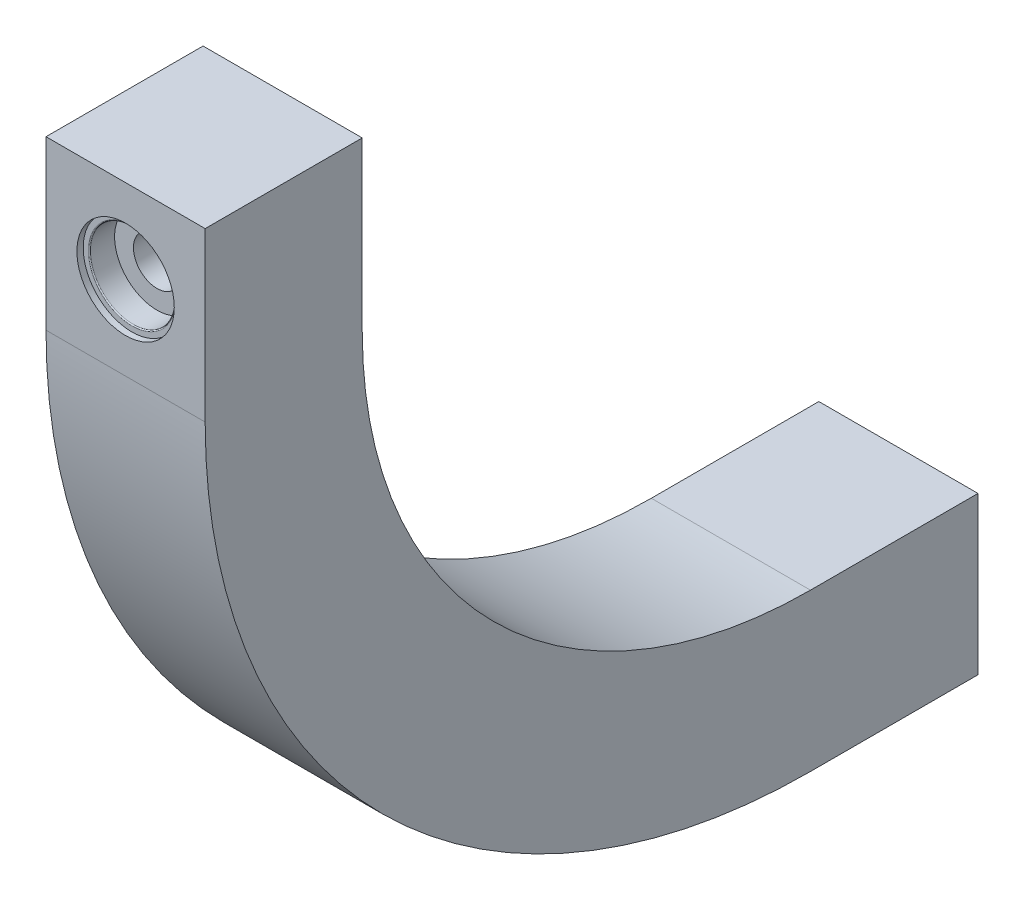
ISO-10303-21;
HEADER;
FILE_DESCRIPTION(('STEP AP214'),'2;1');
FILE_NAME('part.step','',(''),(''),'','','');
FILE_SCHEMA(('AUTOMOTIVE_DESIGN { 1 0 10303 214 1 1 1 1 }'));
ENDSEC;
DATA;
#1=APPLICATION_CONTEXT('core data for automotive mechanical design processes');
#2=APPLICATION_PROTOCOL_DEFINITION('international standard','automotive_design',2000,#1);
#3=PRODUCT_CONTEXT('',#1,'mechanical');
#4=PRODUCT('Part','Part','',(#3));
#5=PRODUCT_RELATED_PRODUCT_CATEGORY('part','',(#4));
#6=PRODUCT_DEFINITION_FORMATION('','',#4);
#7=PRODUCT_DEFINITION_CONTEXT('part definition',#1,'design');
#8=PRODUCT_DEFINITION('design','',#6,#7);
#9=PRODUCT_DEFINITION_SHAPE('','',#8);
#10=(LENGTH_UNIT() NAMED_UNIT(*) SI_UNIT(.MILLI.,.METRE.));
#11=(NAMED_UNIT(*) PLANE_ANGLE_UNIT() SI_UNIT($,.RADIAN.));
#12=(NAMED_UNIT(*) SI_UNIT($,.STERADIAN.) SOLID_ANGLE_UNIT());
#13=UNCERTAINTY_MEASURE_WITH_UNIT(LENGTH_MEASURE(1.E-05),#10,'distance_accuracy_value','');
#14=(GEOMETRIC_REPRESENTATION_CONTEXT(3) GLOBAL_UNCERTAINTY_ASSIGNED_CONTEXT((#13)) GLOBAL_UNIT_ASSIGNED_CONTEXT((#10,
#11,#12)) REPRESENTATION_CONTEXT('',''));
#15=CARTESIAN_POINT('',(0.,0.,0.));
#16=DIRECTION('',(0.,0.,1.));
#17=DIRECTION('',(1.,0.,0.));
#18=AXIS2_PLACEMENT_3D('',#15,#16,#17);
#19=CARTESIAN_POINT('',(-7.6,-7.99999999999999,8.00000000000008));
#20=DIRECTION('',(1.,0.,0.));
#21=DIRECTION('',(0.,0.,-1.));
#22=AXIS2_PLACEMENT_3D('',#19,#20,#21);
#23=CYLINDRICAL_SURFACE('',#22,57.8045814599999);
#24=DIRECTION('',(1.,0.,0.));
#25=VECTOR('',#24,1.);
#26=CARTESIAN_POINT('',(-7.6,-65.8045814599999,8.00000000000068));
#27=LINE('',#26,#25);
#28=CARTESIAN_POINT('',(-7.6,-65.8045814599999,8.00000000000068));
#29=VERTEX_POINT('',#28);
#30=CARTESIAN_POINT('',(7.6,-65.8045814599999,8.00000000000068));
#31=VERTEX_POINT('',#30);
#32=EDGE_CURVE('E100',#29,#31,#27,.T.);
#33=ORIENTED_EDGE('',*,*,#32,.T.);
#34=CARTESIAN_POINT('',(7.6,-7.99999999999999,8.00000000000008));
#35=DIRECTION('',(1.,0.,0.));
#36=DIRECTION('',(0.,0.,-1.));
#37=AXIS2_PLACEMENT_3D('',#34,#35,#36);
#38=CIRCLE('',#37,57.8045814599999);
#39=CARTESIAN_POINT('',(7.6,-7.99999999999999,65.80458146));
#40=VERTEX_POINT('',#39);
#41=EDGE_CURVE('E103',#40,#31,#38,.T.);
#42=ORIENTED_EDGE('',*,*,#41,.F.);
#43=DIRECTION('',(1.,0.,0.));
#44=VECTOR('',#43,1.);
#45=CARTESIAN_POINT('',(-7.6,-7.99999999999999,65.80458146));
#46=LINE('',#45,#44);
#47=CARTESIAN_POINT('',(-7.6,-7.99999999999999,65.80458146));
#48=VERTEX_POINT('',#47);
#49=EDGE_CURVE('E11',#48,#40,#46,.T.);
#50=ORIENTED_EDGE('',*,*,#49,.F.);
#51=CARTESIAN_POINT('',(-7.6,-7.99999999999999,8.00000000000008));
#52=DIRECTION('',(1.,0.,0.));
#53=DIRECTION('',(0.,0.,-1.));
#54=AXIS2_PLACEMENT_3D('',#51,#52,#53);
#55=CIRCLE('',#54,57.8045814599999);
#56=EDGE_CURVE('E104',#48,#29,#55,.T.);
#57=ORIENTED_EDGE('',*,*,#56,.T.);
#58=EDGE_LOOP('',(#33,#42,#50,#57));
#59=FACE_BOUND('',#58,.T.);
#60=ADVANCED_FACE('F38',(#59),#23,.T.);
#61=CARTESIAN_POINT('',(-7.6,-7.99999999999999,65.80458146));
#62=DIRECTION('',(0.,0.,1.));
#63=DIRECTION('',(1.,0.,0.));
#64=AXIS2_PLACEMENT_3D('',#61,#62,#63);
#65=PLANE('',#64);
#66=CARTESIAN_POINT('',(0.,0.,65.80458146));
#67=DIRECTION('',(0.,0.,1.));
#68=DIRECTION('',(1.,0.,0.));
#69=AXIS2_PLACEMENT_3D('',#66,#67,#68);
#70=CIRCLE('',#69,4.65);
#71=CARTESIAN_POINT('',(4.65,0.,65.80458146));
#72=VERTEX_POINT('',#71);
#73=EDGE_CURVE('E198',#72,#72,#70,.T.);
#74=ORIENTED_EDGE('',*,*,#73,.F.);
#75=EDGE_LOOP('',(#74));
#76=FACE_BOUND('',#75,.T.);
#77=ORIENTED_EDGE('',*,*,#49,.T.);
#78=DIRECTION('',(0.,-1.,0.));
#79=VECTOR('',#78,1.);
#80=CARTESIAN_POINT('',(7.6,-7.99999999999999,65.80458146));
#81=LINE('',#80,#79);
#82=CARTESIAN_POINT('',(7.6,8.,65.80458146));
#83=VERTEX_POINT('',#82);
#84=EDGE_CURVE('E122',#83,#40,#81,.T.);
#85=ORIENTED_EDGE('',*,*,#84,.F.);
#86=DIRECTION('',(1.,0.,0.));
#87=VECTOR('',#86,1.);
#88=CARTESIAN_POINT('',(-7.6,8.,65.80458146));
#89=LINE('',#88,#87);
#90=CARTESIAN_POINT('',(-7.6,8.,65.80458146));
#91=VERTEX_POINT('',#90);
#92=EDGE_CURVE('E46',#91,#83,#89,.T.);
#93=ORIENTED_EDGE('',*,*,#92,.F.);
#94=DIRECTION('',(0.,-1.,0.));
#95=VECTOR('',#94,1.);
#96=CARTESIAN_POINT('',(-7.6,-7.99999999999999,65.80458146));
#97=LINE('',#96,#95);
#98=EDGE_CURVE('E109',#91,#48,#97,.T.);
#99=ORIENTED_EDGE('',*,*,#98,.T.);
#100=EDGE_LOOP('',(#77,#85,#93,#99));
#101=FACE_BOUND('',#100,.T.);
#102=ADVANCED_FACE('F228',(#76,#101),#65,.T.);
#103=CARTESIAN_POINT('',(-7.6,8.,65.80458146));
#104=DIRECTION('',(0.,1.,0.));
#105=DIRECTION('',(0.,0.,1.));
#106=AXIS2_PLACEMENT_3D('',#103,#104,#105);
#107=PLANE('',#106);
#108=ORIENTED_EDGE('',*,*,#92,.T.);
#109=DIRECTION('',(0.,0.,1.));
#110=VECTOR('',#109,1.);
#111=CARTESIAN_POINT('',(7.6,8.,65.80458146));
#112=LINE('',#111,#110);
#113=CARTESIAN_POINT('',(7.6,8.,50.80458146));
#114=VERTEX_POINT('',#113);
#115=EDGE_CURVE('E140',#114,#83,#112,.T.);
#116=ORIENTED_EDGE('',*,*,#115,.F.);
#117=DIRECTION('',(1.,0.,0.));
#118=VECTOR('',#117,1.);
#119=CARTESIAN_POINT('',(-7.6,8.,50.80458146));
#120=LINE('',#119,#118);
#121=CARTESIAN_POINT('',(-7.6,8.,50.80458146));
#122=VERTEX_POINT('',#121);
#123=EDGE_CURVE('E160',#122,#114,#120,.T.);
#124=ORIENTED_EDGE('',*,*,#123,.F.);
#125=DIRECTION('',(0.,0.,1.));
#126=VECTOR('',#125,1.);
#127=CARTESIAN_POINT('',(-7.6,8.,65.80458146));
#128=LINE('',#127,#126);
#129=EDGE_CURVE('E156',#122,#91,#128,.T.);
#130=ORIENTED_EDGE('',*,*,#129,.T.);
#131=EDGE_LOOP('',(#108,#116,#124,#130));
#132=FACE_BOUND('',#131,.T.);
#133=ADVANCED_FACE('F233',(#132),#107,.T.);
#134=CARTESIAN_POINT('',(-7.6,8.,50.80458146));
#135=DIRECTION('',(0.,0.,-1.));
#136=DIRECTION('',(-1.,0.,0.));
#137=AXIS2_PLACEMENT_3D('',#134,#135,#136);
#138=PLANE('',#137);
#139=CARTESIAN_POINT('',(0.,0.,50.80458146));
#140=DIRECTION('',(0.,0.,1.));
#141=DIRECTION('',(1.,0.,0.));
#142=AXIS2_PLACEMENT_3D('',#139,#140,#141);
#143=CIRCLE('',#142,4.65000000000001);
#144=CARTESIAN_POINT('',(4.65000000000001,0.,50.80458146));
#145=VERTEX_POINT('',#144);
#146=EDGE_CURVE('E187',#145,#145,#143,.T.);
#147=ORIENTED_EDGE('',*,*,#146,.T.);
#148=EDGE_LOOP('',(#147));
#149=FACE_BOUND('',#148,.T.);
#150=ORIENTED_EDGE('',*,*,#123,.T.);
#151=DIRECTION('',(0.,1.,0.));
#152=VECTOR('',#151,1.);
#153=CARTESIAN_POINT('',(7.6,0.,50.80458146));
#154=LINE('',#153,#152);
#155=CARTESIAN_POINT('',(7.6,-8.,50.80458146));
#156=VERTEX_POINT('',#155);
#157=EDGE_CURVE('E137',#156,#114,#154,.T.);
#158=ORIENTED_EDGE('',*,*,#157,.F.);
#159=DIRECTION('',(1.,0.,0.));
#160=VECTOR('',#159,1.);
#161=CARTESIAN_POINT('',(-7.6,-8.,50.80458146));
#162=LINE('',#161,#160);
#163=CARTESIAN_POINT('',(-7.6,-8.,50.80458146));
#164=VERTEX_POINT('',#163);
#165=EDGE_CURVE('E162',#164,#156,#162,.T.);
#166=ORIENTED_EDGE('',*,*,#165,.F.);
#167=DIRECTION('',(0.,1.,0.));
#168=VECTOR('',#167,1.);
#169=CARTESIAN_POINT('',(-7.6,0.,50.80458146));
#170=LINE('',#169,#168);
#171=EDGE_CURVE('E154',#164,#122,#170,.T.);
#172=ORIENTED_EDGE('',*,*,#171,.T.);
#173=EDGE_LOOP('',(#150,#158,#166,#172));
#174=FACE_BOUND('',#173,.T.);
#175=ADVANCED_FACE('F240',(#149,#174),#138,.T.);
#176=CARTESIAN_POINT('',(-7.6,-7.99999999999999,8.00000000000008));
#177=DIRECTION('',(1.,0.,0.));
#178=DIRECTION('',(0.,0.,-1.));
#179=AXIS2_PLACEMENT_3D('',#176,#177,#178);
#180=CYLINDRICAL_SURFACE('',#179,42.8045814599999);
#181=ORIENTED_EDGE('',*,*,#165,.T.);
#182=CARTESIAN_POINT('',(7.6,-7.99999999999999,8.00000000000008));
#183=DIRECTION('',(-1.,0.,0.));
#184=DIRECTION('',(0.,0.,-1.));
#185=AXIS2_PLACEMENT_3D('',#182,#183,#184);
#186=CIRCLE('',#185,42.8045814599999);
#187=CARTESIAN_POINT('',(7.6,-50.8045814599999,8.00000000000054));
#188=VERTEX_POINT('',#187);
#189=EDGE_CURVE('E134',#188,#156,#186,.T.);
#190=ORIENTED_EDGE('',*,*,#189,.F.);
#191=DIRECTION('',(1.,0.,0.));
#192=VECTOR('',#191,1.);
#193=CARTESIAN_POINT('',(-7.6,-50.8045814599999,8.00000000000054));
#194=LINE('',#193,#192);
#195=CARTESIAN_POINT('',(-7.6,-50.8045814599999,8.00000000000054));
#196=VERTEX_POINT('',#195);
#197=EDGE_CURVE('E164',#196,#188,#194,.T.);
#198=ORIENTED_EDGE('',*,*,#197,.F.);
#199=CARTESIAN_POINT('',(-7.6,-7.99999999999999,8.00000000000008));
#200=DIRECTION('',(-1.,0.,0.));
#201=DIRECTION('',(0.,0.,-1.));
#202=AXIS2_PLACEMENT_3D('',#199,#200,#201);
#203=CIRCLE('',#202,42.8045814599999);
#204=EDGE_CURVE('E151',#196,#164,#203,.T.);
#205=ORIENTED_EDGE('',*,*,#204,.T.);
#206=EDGE_LOOP('',(#181,#190,#198,#205));
#207=FACE_BOUND('',#206,.T.);
#208=ADVANCED_FACE('F248',(#207),#180,.F.);
#209=CARTESIAN_POINT('',(-7.6,-50.80458146,5.34294830600857E-13));
#210=DIRECTION('',(0.,1.,0.));
#211=DIRECTION('',(0.,0.,1.));
#212=AXIS2_PLACEMENT_3D('',#209,#210,#211);
#213=PLANE('',#212);
#214=ORIENTED_EDGE('',*,*,#197,.T.);
#215=DIRECTION('',(0.,0.,1.));
#216=VECTOR('',#215,1.);
#217=CARTESIAN_POINT('',(7.6,-50.8045814600001,-7.99999999999947));
#218=LINE('',#217,#216);
#219=CARTESIAN_POINT('',(7.6,-50.8045814600001,-7.99999999999947));
#220=VERTEX_POINT('',#219);
#221=EDGE_CURVE('E131',#220,#188,#218,.T.);
#222=ORIENTED_EDGE('',*,*,#221,.F.);
#223=DIRECTION('',(1.,0.,0.));
#224=VECTOR('',#223,1.);
#225=CARTESIAN_POINT('',(-7.6,-50.8045814600001,-7.99999999999947));
#226=LINE('',#225,#224);
#227=CARTESIAN_POINT('',(-7.6,-50.8045814600001,-7.99999999999947));
#228=VERTEX_POINT('',#227);
#229=EDGE_CURVE('E166',#228,#220,#226,.T.);
#230=ORIENTED_EDGE('',*,*,#229,.F.);
#231=DIRECTION('',(0.,0.,1.));
#232=VECTOR('',#231,1.);
#233=CARTESIAN_POINT('',(-7.6,-50.8045814600001,-7.99999999999947));
#234=LINE('',#233,#232);
#235=EDGE_CURVE('E149',#228,#196,#234,.T.);
#236=ORIENTED_EDGE('',*,*,#235,.T.);
#237=EDGE_LOOP('',(#214,#222,#230,#236));
#238=FACE_BOUND('',#237,.T.);
#239=ADVANCED_FACE('F252',(#238),#213,.T.);
#240=CARTESIAN_POINT('',(-7.6,-65.8045814600001,-7.9999999999993));
#241=DIRECTION('',(0.,0.,-1.));
#242=DIRECTION('',(0.,1.,0.));
#243=AXIS2_PLACEMENT_3D('',#240,#241,#242);
#244=PLANE('',#243);
#245=ORIENTED_EDGE('',*,*,#229,.T.);
#246=DIRECTION('',(0.,1.,0.));
#247=VECTOR('',#246,1.);
#248=CARTESIAN_POINT('',(7.6,-65.8045814600001,-7.9999999999993));
#249=LINE('',#248,#247);
#250=CARTESIAN_POINT('',(7.6,-65.8045814600001,-7.9999999999993));
#251=VERTEX_POINT('',#250);
#252=EDGE_CURVE('E117',#251,#220,#249,.T.);
#253=ORIENTED_EDGE('',*,*,#252,.F.);
#254=DIRECTION('',(1.,0.,0.));
#255=VECTOR('',#254,1.);
#256=CARTESIAN_POINT('',(-7.6,-65.8045814600001,-7.9999999999993));
#257=LINE('',#256,#255);
#258=CARTESIAN_POINT('',(-7.6,-65.8045814600001,-7.9999999999993));
#259=VERTEX_POINT('',#258);
#260=EDGE_CURVE('E108',#259,#251,#257,.T.);
#261=ORIENTED_EDGE('',*,*,#260,.F.);
#262=DIRECTION('',(0.,1.,0.));
#263=VECTOR('',#262,1.);
#264=CARTESIAN_POINT('',(-7.6,-65.8045814600001,-7.9999999999993));
#265=LINE('',#264,#263);
#266=EDGE_CURVE('E146',#259,#228,#265,.T.);
#267=ORIENTED_EDGE('',*,*,#266,.T.);
#268=EDGE_LOOP('',(#245,#253,#261,#267));
#269=FACE_BOUND('',#268,.T.);
#270=ADVANCED_FACE('F256',(#269),#244,.T.);
#271=CARTESIAN_POINT('',(-7.6,-65.8045814599999,8.00000000000068));
#272=DIRECTION('',(0.,-1.,0.));
#273=DIRECTION('',(0.,0.,-1.));
#274=AXIS2_PLACEMENT_3D('',#271,#272,#273);
#275=PLANE('',#274);
#276=CARTESIAN_POINT('',(0.,-65.80458146,6.84916513712941E-13));
#277=DIRECTION('',(0.,-1.,0.));
#278=DIRECTION('',(0.,0.,-1.));
#279=AXIS2_PLACEMENT_3D('',#276,#277,#278);
#280=CIRCLE('',#279,2.);
#281=CARTESIAN_POINT('',(0.,-65.80458146,-1.99999999999932));
#282=VERTEX_POINT('',#281);
#283=EDGE_CURVE('E126',#282,#282,#280,.T.);
#284=ORIENTED_EDGE('',*,*,#283,.F.);
#285=EDGE_LOOP('',(#284));
#286=FACE_BOUND('',#285,.T.);
#287=ORIENTED_EDGE('',*,*,#260,.T.);
#288=DIRECTION('',(0.,0.,-1.));
#289=VECTOR('',#288,1.);
#290=CARTESIAN_POINT('',(7.6,-65.8045814599999,8.00000000000068));
#291=LINE('',#290,#289);
#292=EDGE_CURVE('E112',#31,#251,#291,.T.);
#293=ORIENTED_EDGE('',*,*,#292,.F.);
#294=ORIENTED_EDGE('',*,*,#32,.F.);
#295=DIRECTION('',(0.,0.,-1.));
#296=VECTOR('',#295,1.);
#297=CARTESIAN_POINT('',(-7.6,-65.8045814599999,8.00000000000068));
#298=LINE('',#297,#296);
#299=EDGE_CURVE('E144',#29,#259,#298,.T.);
#300=ORIENTED_EDGE('',*,*,#299,.T.);
#301=EDGE_LOOP('',(#287,#293,#294,#300));
#302=FACE_BOUND('',#301,.T.);
#303=ADVANCED_FACE('F113',(#286,#302),#275,.T.);
#304=CARTESIAN_POINT('',(-7.6,-7.99999999999999,8.00000000000008));
#305=DIRECTION('',(1.,0.,0.));
#306=DIRECTION('',(0.,0.,-1.));
#307=AXIS2_PLACEMENT_3D('',#304,#305,#306);
#308=PLANE('',#307);
#309=ORIENTED_EDGE('',*,*,#56,.F.);
#310=ORIENTED_EDGE('',*,*,#98,.F.);
#311=ORIENTED_EDGE('',*,*,#129,.F.);
#312=ORIENTED_EDGE('',*,*,#171,.F.);
#313=ORIENTED_EDGE('',*,*,#204,.F.);
#314=ORIENTED_EDGE('',*,*,#235,.F.);
#315=ORIENTED_EDGE('',*,*,#266,.F.);
#316=ORIENTED_EDGE('',*,*,#299,.F.);
#317=EDGE_LOOP('',(#309,#310,#311,#312,#313,#314,#315,#316));
#318=FACE_BOUND('',#317,.T.);
#319=ADVANCED_FACE('F244',(#318),#308,.F.);
#320=CARTESIAN_POINT('',(7.6,-7.99999999999999,8.00000000000008));
#321=DIRECTION('',(1.,0.,0.));
#322=DIRECTION('',(0.,0.,-1.));
#323=AXIS2_PLACEMENT_3D('',#320,#321,#322);
#324=PLANE('',#323);
#325=ORIENTED_EDGE('',*,*,#41,.T.);
#326=ORIENTED_EDGE('',*,*,#292,.T.);
#327=ORIENTED_EDGE('',*,*,#252,.T.);
#328=ORIENTED_EDGE('',*,*,#221,.T.);
#329=ORIENTED_EDGE('',*,*,#189,.T.);
#330=ORIENTED_EDGE('',*,*,#157,.T.);
#331=ORIENTED_EDGE('',*,*,#115,.T.);
#332=ORIENTED_EDGE('',*,*,#84,.T.);
#333=EDGE_LOOP('',(#325,#326,#327,#328,#329,#330,#331,#332));
#334=FACE_BOUND('',#333,.T.);
#335=ADVANCED_FACE('F120',(#334),#324,.T.);
#336=CARTESIAN_POINT('',(0.,-55.80458146,5.80833105154333E-13));
#337=DIRECTION('',(0.,-1.,0.));
#338=DIRECTION('',(0.,0.,-1.));
#339=AXIS2_PLACEMENT_3D('',#336,#337,#338);
#340=CYLINDRICAL_SURFACE('',#339,2.);
#341=CARTESIAN_POINT('',(0.,-55.80458146,5.80833105154333E-13));
#342=DIRECTION('',(0.,-1.,0.));
#343=DIRECTION('',(0.,0.,-1.));
#344=AXIS2_PLACEMENT_3D('',#341,#342,#343);
#345=CIRCLE('',#344,2.);
#346=CARTESIAN_POINT('',(0.,-55.80458146,-1.99999999999942));
#347=VERTEX_POINT('',#346);
#348=EDGE_CURVE('E123',#347,#347,#345,.T.);
#349=ORIENTED_EDGE('',*,*,#348,.F.);
#350=EDGE_LOOP('',(#349));
#351=FACE_BOUND('',#350,.T.);
#352=ORIENTED_EDGE('',*,*,#283,.T.);
#353=EDGE_LOOP('',(#352));
#354=FACE_BOUND('',#353,.T.);
#355=ADVANCED_FACE('F271',(#351,#354),#340,.F.);
#356=CARTESIAN_POINT('',(0.,-55.80458146,5.80833105154333E-13));
#357=DIRECTION('',(0.,-1.,0.));
#358=DIRECTION('',(0.,0.,-1.));
#359=AXIS2_PLACEMENT_3D('',#356,#357,#358);
#360=PLANE('',#359);
#361=ORIENTED_EDGE('',*,*,#348,.T.);
#362=EDGE_LOOP('',(#361));
#363=FACE_BOUND('',#362,.T.);
#364=ADVANCED_FACE('F272',(#363),#360,.T.);
#365=CARTESIAN_POINT('',(0.,4.15000000000001,51.40458146));
#366=DIRECTION('',(0.,0.,-1.));
#367=DIRECTION('',(-1.,0.,0.));
#368=AXIS2_PLACEMENT_3D('',#365,#366,#367);
#369=PLANE('',#368);
#370=CARTESIAN_POINT('',(0.,0.,51.40458146));
#371=DIRECTION('',(0.,0.,1.));
#372=DIRECTION('',(1.,0.,0.));
#373=AXIS2_PLACEMENT_3D('',#370,#371,#372);
#374=CIRCLE('',#373,4.15000000000001);
#375=CARTESIAN_POINT('',(4.15000000000001,0.,51.40458146));
#376=VERTEX_POINT('',#375);
#377=EDGE_CURVE('E196',#376,#376,#374,.T.);
#378=ORIENTED_EDGE('',*,*,#377,.T.);
#379=EDGE_LOOP('',(#378));
#380=FACE_BOUND('',#379,.T.);
#381=CARTESIAN_POINT('',(0.,0.,51.40458146));
#382=DIRECTION('',(0.,0.,1.));
#383=DIRECTION('',(1.,0.,0.));
#384=AXIS2_PLACEMENT_3D('',#381,#382,#383);
#385=CIRCLE('',#384,4.65000000000001);
#386=CARTESIAN_POINT('',(4.65000000000001,0.,51.40458146));
#387=VERTEX_POINT('',#386);
#388=EDGE_CURVE('E184',#387,#387,#385,.T.);
#389=ORIENTED_EDGE('',*,*,#388,.F.);
#390=EDGE_LOOP('',(#389));
#391=FACE_BOUND('',#390,.T.);
#392=ADVANCED_FACE('F277',(#380,#391),#369,.T.);
#393=CARTESIAN_POINT('',(0.,0.,51.50458146));
#394=DIRECTION('',(0.,0.,1.));
#395=DIRECTION('',(1.,0.,0.));
#396=AXIS2_PLACEMENT_3D('',#393,#394,#395);
#397=TOROIDAL_SURFACE('',#396,4.15000000000001,0.100000000000002);
#398=CARTESIAN_POINT('',(0.,0.,51.50458146));
#399=DIRECTION('',(0.,0.,1.));
#400=DIRECTION('',(1.,0.,0.));
#401=AXIS2_PLACEMENT_3D('',#398,#399,#400);
#402=CIRCLE('',#401,4.05000000000001);
#403=CARTESIAN_POINT('',(4.05000000000001,0.,51.50458146));
#404=VERTEX_POINT('',#403);
#405=EDGE_CURVE('E193',#404,#404,#402,.T.);
#406=ORIENTED_EDGE('',*,*,#405,.T.);
#407=EDGE_LOOP('',(#406));
#408=FACE_BOUND('',#407,.T.);
#409=ORIENTED_EDGE('',*,*,#377,.F.);
#410=EDGE_LOOP('',(#409));
#411=FACE_BOUND('',#410,.T.);
#412=ADVANCED_FACE('F350',(#408,#411),#397,.T.);
#413=CARTESIAN_POINT('',(0.,0.,109.55852769686));
#414=DIRECTION('',(0.,0.,1.));
#415=DIRECTION('',(1.,0.,0.));
#416=AXIS2_PLACEMENT_3D('',#413,#414,#415);
#417=CYLINDRICAL_SURFACE('',#416,4.05000000000001);
#418=CARTESIAN_POINT('',(0.,0.,53.80458146));
#419=DIRECTION('',(0.,0.,1.));
#420=DIRECTION('',(1.,0.,0.));
#421=AXIS2_PLACEMENT_3D('',#418,#419,#420);
#422=CIRCLE('',#421,4.05000000000001);
#423=CARTESIAN_POINT('',(4.05000000000001,0.,53.80458146));
#424=VERTEX_POINT('',#423);
#425=EDGE_CURVE('E190',#424,#424,#422,.T.);
#426=ORIENTED_EDGE('',*,*,#425,.T.);
#427=EDGE_LOOP('',(#426));
#428=FACE_BOUND('',#427,.T.);
#429=ORIENTED_EDGE('',*,*,#405,.F.);
#430=EDGE_LOOP('',(#429));
#431=FACE_BOUND('',#430,.T.);
#432=ADVANCED_FACE('F340',(#428,#431),#417,.F.);
#433=CARTESIAN_POINT('',(0.,0.,53.80458146));
#434=DIRECTION('',(0.,0.,-1.));
#435=DIRECTION('',(-1.,0.,0.));
#436=AXIS2_PLACEMENT_3D('',#433,#434,#435);
#437=PLANE('',#436);
#438=CARTESIAN_POINT('',(0.,0.,53.80458146));
#439=DIRECTION('',(0.,0.,-1.));
#440=DIRECTION('',(-1.,0.,0.));
#441=AXIS2_PLACEMENT_3D('',#438,#439,#440);
#442=CIRCLE('',#441,2.25);
#443=CARTESIAN_POINT('',(-2.25,0.,53.80458146));
#444=VERTEX_POINT('',#443);
#445=EDGE_CURVE('E168',#444,#444,#442,.T.);
#446=ORIENTED_EDGE('',*,*,#445,.F.);
#447=EDGE_LOOP('',(#446));
#448=FACE_BOUND('',#447,.T.);
#449=ORIENTED_EDGE('',*,*,#425,.F.);
#450=EDGE_LOOP('',(#449));
#451=FACE_BOUND('',#450,.T.);
#452=ADVANCED_FACE('F330',(#448,#451),#437,.T.);
#453=CARTESIAN_POINT('',(0.,0.,109.55852769686));
#454=DIRECTION('',(0.,0.,1.));
#455=DIRECTION('',(1.,0.,0.));
#456=AXIS2_PLACEMENT_3D('',#453,#454,#455);
#457=CYLINDRICAL_SURFACE('',#456,4.65000000000001);
#458=ORIENTED_EDGE('',*,*,#388,.T.);
#459=EDGE_LOOP('',(#458));
#460=FACE_BOUND('',#459,.T.);
#461=ORIENTED_EDGE('',*,*,#146,.F.);
#462=EDGE_LOOP('',(#461));
#463=FACE_BOUND('',#462,.T.);
#464=ADVANCED_FACE('F321',(#460,#463),#457,.F.);
#465=CARTESIAN_POINT('',(0.,0.,109.55852769686));
#466=DIRECTION('',(0.,0.,1.));
#467=DIRECTION('',(1.,0.,0.));
#468=AXIS2_PLACEMENT_3D('',#465,#466,#467);
#469=CYLINDRICAL_SURFACE('',#468,4.65);
#470=ORIENTED_EDGE('',*,*,#73,.T.);
#471=EDGE_LOOP('',(#470));
#472=FACE_BOUND('',#471,.T.);
#473=CARTESIAN_POINT('',(0.,0.,65.20458146));
#474=DIRECTION('',(0.,0.,1.));
#475=DIRECTION('',(1.,0.,0.));
#476=AXIS2_PLACEMENT_3D('',#473,#474,#475);
#477=CIRCLE('',#476,4.65);
#478=CARTESIAN_POINT('',(4.65,0.,65.20458146));
#479=VERTEX_POINT('',#478);
#480=EDGE_CURVE('E170',#479,#479,#477,.T.);
#481=ORIENTED_EDGE('',*,*,#480,.F.);
#482=EDGE_LOOP('',(#481));
#483=FACE_BOUND('',#482,.T.);
#484=ADVANCED_FACE('F225',(#472,#483),#469,.F.);
#485=CARTESIAN_POINT('',(0.,4.15,65.20458146));
#486=DIRECTION('',(0.,0.,1.));
#487=DIRECTION('',(1.,0.,0.));
#488=AXIS2_PLACEMENT_3D('',#485,#486,#487);
#489=PLANE('',#488);
#490=ORIENTED_EDGE('',*,*,#480,.T.);
#491=EDGE_LOOP('',(#490));
#492=FACE_BOUND('',#491,.T.);
#493=CARTESIAN_POINT('',(0.,0.,65.20458146));
#494=DIRECTION('',(0.,0.,1.));
#495=DIRECTION('',(1.,0.,0.));
#496=AXIS2_PLACEMENT_3D('',#493,#494,#495);
#497=CIRCLE('',#496,4.15);
#498=CARTESIAN_POINT('',(4.15,0.,65.20458146));
#499=VERTEX_POINT('',#498);
#500=EDGE_CURVE('E175',#499,#499,#497,.T.);
#501=ORIENTED_EDGE('',*,*,#500,.F.);
#502=EDGE_LOOP('',(#501));
#503=FACE_BOUND('',#502,.T.);
#504=ADVANCED_FACE('F216',(#492,#503),#489,.T.);
#505=CARTESIAN_POINT('',(0.,0.,65.10458146));
#506=DIRECTION('',(0.,0.,1.));
#507=DIRECTION('',(1.,0.,0.));
#508=AXIS2_PLACEMENT_3D('',#505,#506,#507);
#509=TOROIDAL_SURFACE('',#508,4.15,0.100000000000002);
#510=ORIENTED_EDGE('',*,*,#500,.T.);
#511=EDGE_LOOP('',(#510));
#512=FACE_BOUND('',#511,.T.);
#513=CARTESIAN_POINT('',(0.,0.,65.10458146));
#514=DIRECTION('',(0.,0.,1.));
#515=DIRECTION('',(1.,0.,0.));
#516=AXIS2_PLACEMENT_3D('',#513,#514,#515);
#517=CIRCLE('',#516,4.05);
#518=CARTESIAN_POINT('',(4.05,0.,65.10458146));
#519=VERTEX_POINT('',#518);
#520=EDGE_CURVE('E180',#519,#519,#517,.T.);
#521=ORIENTED_EDGE('',*,*,#520,.F.);
#522=EDGE_LOOP('',(#521));
#523=FACE_BOUND('',#522,.T.);
#524=ADVANCED_FACE('F214',(#512,#523),#509,.T.);
#525=CARTESIAN_POINT('',(0.,0.,109.55852769686));
#526=DIRECTION('',(0.,0.,1.));
#527=DIRECTION('',(1.,0.,0.));
#528=AXIS2_PLACEMENT_3D('',#525,#526,#527);
#529=CYLINDRICAL_SURFACE('',#528,4.05);
#530=ORIENTED_EDGE('',*,*,#520,.T.);
#531=EDGE_LOOP('',(#530));
#532=FACE_BOUND('',#531,.T.);
#533=CARTESIAN_POINT('',(0.,0.,62.80458146));
#534=DIRECTION('',(0.,0.,1.));
#535=DIRECTION('',(1.,0.,0.));
#536=AXIS2_PLACEMENT_3D('',#533,#534,#535);
#537=CIRCLE('',#536,4.05);
#538=CARTESIAN_POINT('',(4.05,0.,62.80458146));
#539=VERTEX_POINT('',#538);
#540=EDGE_CURVE('E202',#539,#539,#537,.T.);
#541=ORIENTED_EDGE('',*,*,#540,.F.);
#542=EDGE_LOOP('',(#541));
#543=FACE_BOUND('',#542,.T.);
#544=ADVANCED_FACE('F211',(#532,#543),#529,.F.);
#545=CARTESIAN_POINT('',(0.,0.,62.80458146));
#546=DIRECTION('',(0.,0.,1.));
#547=DIRECTION('',(1.,0.,0.));
#548=AXIS2_PLACEMENT_3D('',#545,#546,#547);
#549=PLANE('',#548);
#550=CARTESIAN_POINT('',(0.,0.,62.80458146));
#551=DIRECTION('',(0.,0.,1.));
#552=DIRECTION('',(1.,0.,0.));
#553=AXIS2_PLACEMENT_3D('',#550,#551,#552);
#554=CIRCLE('',#553,2.25);
#555=CARTESIAN_POINT('',(2.25,0.,62.80458146));
#556=VERTEX_POINT('',#555);
#557=EDGE_CURVE('E41',#556,#556,#554,.T.);
#558=ORIENTED_EDGE('',*,*,#557,.F.);
#559=EDGE_LOOP('',(#558));
#560=FACE_BOUND('',#559,.T.);
#561=ORIENTED_EDGE('',*,*,#540,.T.);
#562=EDGE_LOOP('',(#561));
#563=FACE_BOUND('',#562,.T.);
#564=ADVANCED_FACE('F223',(#560,#563),#549,.T.);
#565=CARTESIAN_POINT('',(0.,0.,65.80458146));
#566=DIRECTION('',(0.,0.,-1.));
#567=DIRECTION('',(-1.,0.,0.));
#568=AXIS2_PLACEMENT_3D('',#565,#566,#567);
#569=CYLINDRICAL_SURFACE('',#568,2.25);
#570=ORIENTED_EDGE('',*,*,#445,.T.);
#571=EDGE_LOOP('',(#570));
#572=FACE_BOUND('',#571,.T.);
#573=ORIENTED_EDGE('',*,*,#557,.T.);
#574=EDGE_LOOP('',(#573));
#575=FACE_BOUND('',#574,.T.);
#576=ADVANCED_FACE('F283',(#572,#575),#569,.F.);
#577=CLOSED_SHELL('',(#60,#102,#133,#175,#208,#239,#270,#303,#319,#335,#355,#364,#392,#412,#432,
#452,#464,#484,#504,#524,#544,#564,#576));
#578=MANIFOLD_SOLID_BREP('B2',#577);
#579=ADVANCED_BREP_SHAPE_REPRESENTATION('',(#18,#578),#14);
#580=SHAPE_DEFINITION_REPRESENTATION(#9,#579);
ENDSEC;
END-ISO-10303-21;
